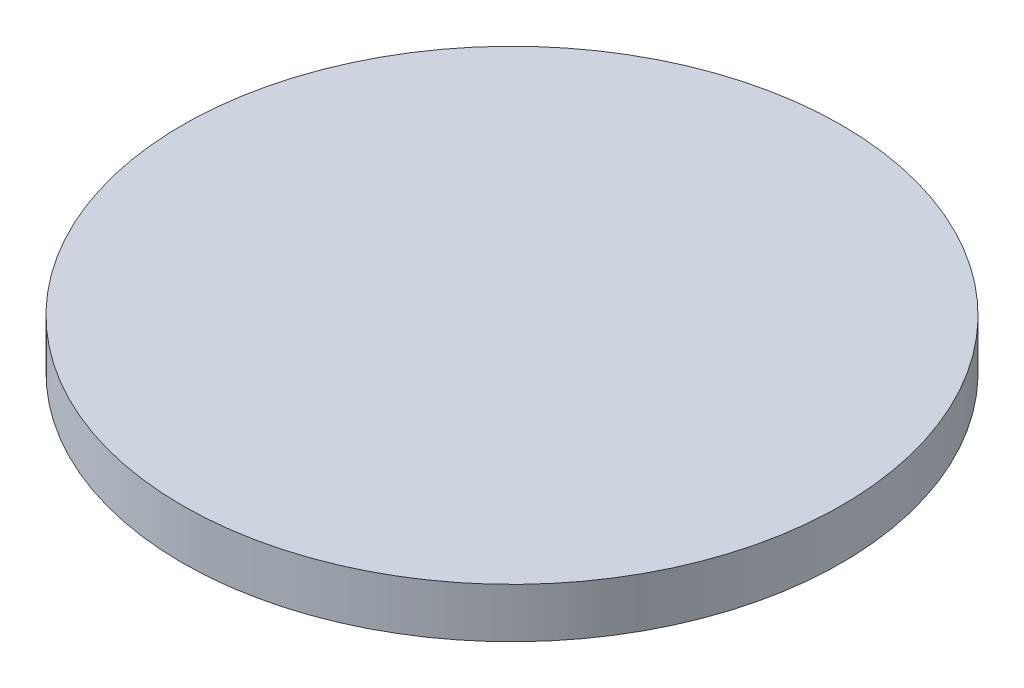
ISO-10303-21;
HEADER;
FILE_DESCRIPTION(('STEP AP214'),'2;1');
FILE_NAME('part.step','',(''),(''),'','','');
FILE_SCHEMA(('AUTOMOTIVE_DESIGN { 1 0 10303 214 1 1 1 1 }'));
ENDSEC;
DATA;
#1=APPLICATION_CONTEXT('core data for automotive mechanical design processes');
#2=APPLICATION_PROTOCOL_DEFINITION('international standard','automotive_design',2000,#1);
#3=PRODUCT_CONTEXT('',#1,'mechanical');
#4=PRODUCT('Part','Part','',(#3));
#5=PRODUCT_RELATED_PRODUCT_CATEGORY('part','',(#4));
#6=PRODUCT_DEFINITION_FORMATION('','',#4);
#7=PRODUCT_DEFINITION_CONTEXT('part definition',#1,'design');
#8=PRODUCT_DEFINITION('design','',#6,#7);
#9=PRODUCT_DEFINITION_SHAPE('','',#8);
#10=(LENGTH_UNIT() NAMED_UNIT(*) SI_UNIT(.MILLI.,.METRE.));
#11=(NAMED_UNIT(*) PLANE_ANGLE_UNIT() SI_UNIT($,.RADIAN.));
#12=(NAMED_UNIT(*) SI_UNIT($,.STERADIAN.) SOLID_ANGLE_UNIT());
#13=UNCERTAINTY_MEASURE_WITH_UNIT(LENGTH_MEASURE(1.E-05),#10,'distance_accuracy_value','');
#14=(GEOMETRIC_REPRESENTATION_CONTEXT(3) GLOBAL_UNCERTAINTY_ASSIGNED_CONTEXT((#13)) GLOBAL_UNIT_ASSIGNED_CONTEXT((#10,
#11,#12)) REPRESENTATION_CONTEXT('',''));
#15=CARTESIAN_POINT('',(0.,0.,0.));
#16=DIRECTION('',(0.,0.,1.));
#17=DIRECTION('',(1.,0.,0.));
#18=AXIS2_PLACEMENT_3D('',#15,#16,#17);
#19=CARTESIAN_POINT('',(0.,1.35,0.));
#20=DIRECTION('',(0.,-1.,0.));
#21=DIRECTION('',(0.,0.,-1.));
#22=AXIS2_PLACEMENT_3D('',#19,#20,#21);
#23=CYLINDRICAL_SURFACE('',#22,8.9535);
#24=CARTESIAN_POINT('',(0.,1.35,0.));
#25=DIRECTION('',(0.,1.,0.));
#26=DIRECTION('',(0.,0.,1.));
#27=AXIS2_PLACEMENT_3D('',#24,#25,#26);
#28=CIRCLE('',#27,8.9535);
#29=CARTESIAN_POINT('',(0.,1.35,-8.9535));
#30=VERTEX_POINT('',#29);
#31=EDGE_CURVE('E10',#30,#30,#28,.T.);
#32=CARTESIAN_POINT('',(0.,0.,0.));
#33=DIRECTION('',(0.,1.,0.));
#34=DIRECTION('',(0.,0.,1.));
#35=AXIS2_PLACEMENT_3D('',#32,#33,#34);
#36=CIRCLE('',#35,8.9535);
#37=CARTESIAN_POINT('',(0.,0.,-8.9535));
#38=VERTEX_POINT('',#37);
#39=EDGE_CURVE('E44',#38,#38,#36,.T.);
#40=CARTESIAN_POINT('',(0.,1.35,-8.9535));
#41=CARTESIAN_POINT('',(0.,1.3359375,-8.9535));
#42=CARTESIAN_POINT('',(0.,1.321875,-8.9535));
#43=CARTESIAN_POINT('',(0.,1.29375,-8.9535));
#44=CARTESIAN_POINT('',(0.,1.2796875,-8.9535));
#45=CARTESIAN_POINT('',(0.,1.2515625,-8.9535));
#46=CARTESIAN_POINT('',(0.,1.2375,-8.9535));
#47=CARTESIAN_POINT('',(0.,1.209375,-8.9535));
#48=CARTESIAN_POINT('',(0.,1.1953125,-8.9535));
#49=CARTESIAN_POINT('',(0.,1.1671875,-8.9535));
#50=CARTESIAN_POINT('',(0.,1.153125,-8.9535));
#51=CARTESIAN_POINT('',(0.,1.125,-8.9535));
#52=CARTESIAN_POINT('',(0.,1.1109375,-8.9535));
#53=CARTESIAN_POINT('',(0.,1.0828125,-8.9535));
#54=CARTESIAN_POINT('',(0.,1.06875,-8.9535));
#55=CARTESIAN_POINT('',(0.,1.040625,-8.9535));
#56=CARTESIAN_POINT('',(0.,1.0265625,-8.9535));
#57=CARTESIAN_POINT('',(0.,0.9984375,-8.9535));
#58=CARTESIAN_POINT('',(0.,0.984375,-8.9535));
#59=CARTESIAN_POINT('',(0.,0.95625,-8.9535));
#60=CARTESIAN_POINT('',(0.,0.9421875,-8.9535));
#61=CARTESIAN_POINT('',(0.,0.9140625,-8.9535));
#62=CARTESIAN_POINT('',(0.,0.9,-8.9535));
#63=CARTESIAN_POINT('',(0.,0.871875,-8.9535));
#64=CARTESIAN_POINT('',(0.,0.8578125,-8.9535));
#65=CARTESIAN_POINT('',(0.,0.8296875,-8.9535));
#66=CARTESIAN_POINT('',(0.,0.815625,-8.9535));
#67=CARTESIAN_POINT('',(0.,0.7875,-8.9535));
#68=CARTESIAN_POINT('',(0.,0.7734375,-8.9535));
#69=CARTESIAN_POINT('',(0.,0.7453125,-8.9535));
#70=CARTESIAN_POINT('',(0.,0.73125,-8.9535));
#71=CARTESIAN_POINT('',(0.,0.703125,-8.9535));
#72=CARTESIAN_POINT('',(0.,0.6890625,-8.9535));
#73=CARTESIAN_POINT('',(0.,0.6609375,-8.9535));
#74=CARTESIAN_POINT('',(0.,0.646875,-8.9535));
#75=CARTESIAN_POINT('',(0.,0.61875,-8.9535));
#76=CARTESIAN_POINT('',(0.,0.6046875,-8.9535));
#77=CARTESIAN_POINT('',(0.,0.5765625,-8.9535));
#78=CARTESIAN_POINT('',(0.,0.5625,-8.9535));
#79=CARTESIAN_POINT('',(0.,0.534375,-8.9535));
#80=CARTESIAN_POINT('',(0.,0.5203125,-8.9535));
#81=CARTESIAN_POINT('',(0.,0.4921875,-8.9535));
#82=CARTESIAN_POINT('',(0.,0.478125,-8.9535));
#83=CARTESIAN_POINT('',(0.,0.45,-8.9535));
#84=CARTESIAN_POINT('',(0.,0.4359375,-8.9535));
#85=CARTESIAN_POINT('',(0.,0.4078125,-8.9535));
#86=CARTESIAN_POINT('',(0.,0.39375,-8.9535));
#87=CARTESIAN_POINT('',(0.,0.365625,-8.9535));
#88=CARTESIAN_POINT('',(0.,0.3515625,-8.9535));
#89=CARTESIAN_POINT('',(0.,0.3234375,-8.9535));
#90=CARTESIAN_POINT('',(0.,0.309375,-8.9535));
#91=CARTESIAN_POINT('',(0.,0.28125,-8.9535));
#92=CARTESIAN_POINT('',(0.,0.2671875,-8.9535));
#93=CARTESIAN_POINT('',(0.,0.2390625,-8.9535));
#94=CARTESIAN_POINT('',(0.,0.225,-8.9535));
#95=CARTESIAN_POINT('',(0.,0.196875,-8.9535));
#96=CARTESIAN_POINT('',(0.,0.1828125,-8.9535));
#97=CARTESIAN_POINT('',(0.,0.1546875,-8.9535));
#98=CARTESIAN_POINT('',(0.,0.140625,-8.9535));
#99=CARTESIAN_POINT('',(0.,0.1125,-8.9535));
#100=CARTESIAN_POINT('',(0.,0.0984374999999998,-8.9535));
#101=CARTESIAN_POINT('',(0.,0.0703124999999998,-8.9535));
#102=CARTESIAN_POINT('',(0.,0.0562499999999999,-8.9535));
#103=CARTESIAN_POINT('',(0.,0.0281249999999999,-8.9535));
#104=CARTESIAN_POINT('',(0.,0.0140624999999998,-8.9535));
#105=CARTESIAN_POINT('',(0.,0.,-8.9535));
#106=B_SPLINE_CURVE_WITH_KNOTS('',3,(#40,#41,#42,#43,#44,#45,#46,#47,#48,#49,#50,#51,#52,#53,
#54,#55,#56,#57,#58,#59,#60,#61,#62,#63,#64,#65,#66,#67,#68,#69,#70,#71,#72,#73,#74,#75,#76,#77,
#78,#79,#80,#81,#82,#83,#84,#85,#86,#87,#88,#89,#90,#91,#92,#93,#94,#95,#96,#97,#98,#99,#100,
#101,#102,#103,#104,#105),.UNSPECIFIED.,.F.,.F.,(4,2,2,2,2,2,2,2,2,2,2,2,2,2,2,2,2,2,2,2,2,2,2,
2,2,2,2,2,2,2,2,2,4),(0.,0.0421875000000001,0.084375,0.1265625,0.16875,0.2109375,0.253125,
0.2953125,0.3375,0.3796875,0.421875,0.4640625,0.50625,0.5484375,0.590625,0.6328125,0.675,
0.7171875,0.759375,0.8015625,0.84375,0.8859375,0.928125,0.9703125,1.0125,1.0546875,1.096875,
1.1390625,1.18125,1.2234375,1.265625,1.3078125,1.35),.UNSPECIFIED.);
#107=EDGE_CURVE('BSEAM41',#30,#38,#106,.T.);
#108=ORIENTED_EDGE('',*,*,#31,.F.);
#109=ORIENTED_EDGE('',*,*,#39,.T.);
#110=ORIENTED_EDGE('',*,*,#107,.T.);
#111=ORIENTED_EDGE('',*,*,#107,.F.);
#112=EDGE_LOOP('',(#108,#110,#109,#111));
#113=FACE_BOUND('',#112,.T.);
#114=ADVANCED_FACE('F41',(#113),#23,.T.);
#115=CARTESIAN_POINT('',(0.,1.35,0.));
#116=DIRECTION('',(0.,1.,0.));
#117=DIRECTION('',(0.,0.,1.));
#118=AXIS2_PLACEMENT_3D('',#115,#116,#117);
#119=PLANE('',#118);
#120=ORIENTED_EDGE('',*,*,#31,.T.);
#121=EDGE_LOOP('',(#120));
#122=FACE_BOUND('',#121,.T.);
#123=ADVANCED_FACE('F58',(#122),#119,.T.);
#124=CARTESIAN_POINT('',(0.,0.,0.));
#125=DIRECTION('',(0.,1.,0.));
#126=DIRECTION('',(0.,0.,1.));
#127=AXIS2_PLACEMENT_3D('',#124,#125,#126);
#128=PLANE('',#127);
#129=ORIENTED_EDGE('',*,*,#39,.F.);
#130=EDGE_LOOP('',(#129));
#131=FACE_BOUND('',#130,.T.);
#132=ADVANCED_FACE('F56',(#131),#128,.F.);
#133=CLOSED_SHELL('',(#114,#123,#132));
#134=MANIFOLD_SOLID_BREP('B2',#133);
#135=ADVANCED_BREP_SHAPE_REPRESENTATION('',(#18,#134),#14);
#136=SHAPE_DEFINITION_REPRESENTATION(#9,#135);
ENDSEC;
END-ISO-10303-21;
